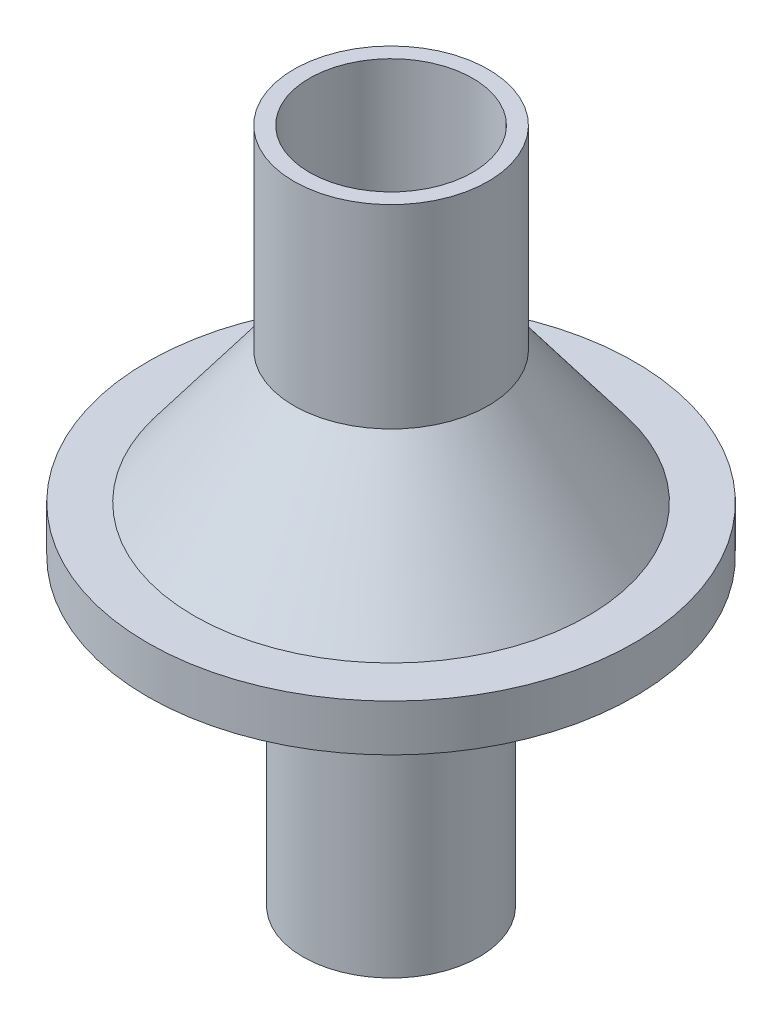
ISO-10303-21;
HEADER;
FILE_DESCRIPTION(('STEP AP214'),'2;1');
FILE_NAME('part.step','',(''),(''),'','','');
FILE_SCHEMA(('AUTOMOTIVE_DESIGN { 1 0 10303 214 1 1 1 1 }'));
ENDSEC;
DATA;
#1=APPLICATION_CONTEXT('core data for automotive mechanical design processes');
#2=APPLICATION_PROTOCOL_DEFINITION('international standard','automotive_design',2000,#1);
#3=PRODUCT_CONTEXT('',#1,'mechanical');
#4=PRODUCT('Part','Part','',(#3));
#5=PRODUCT_RELATED_PRODUCT_CATEGORY('part','',(#4));
#6=PRODUCT_DEFINITION_FORMATION('','',#4);
#7=PRODUCT_DEFINITION_CONTEXT('part definition',#1,'design');
#8=PRODUCT_DEFINITION('design','',#6,#7);
#9=PRODUCT_DEFINITION_SHAPE('','',#8);
#10=(LENGTH_UNIT() NAMED_UNIT(*) SI_UNIT(.MILLI.,.METRE.));
#11=(NAMED_UNIT(*) PLANE_ANGLE_UNIT() SI_UNIT($,.RADIAN.));
#12=(NAMED_UNIT(*) SI_UNIT($,.STERADIAN.) SOLID_ANGLE_UNIT());
#13=UNCERTAINTY_MEASURE_WITH_UNIT(LENGTH_MEASURE(1.E-05),#10,'distance_accuracy_value','');
#14=(GEOMETRIC_REPRESENTATION_CONTEXT(3) GLOBAL_UNCERTAINTY_ASSIGNED_CONTEXT((#13)) GLOBAL_UNIT_ASSIGNED_CONTEXT((#10,
#11,#12)) REPRESENTATION_CONTEXT('',''));
#15=CARTESIAN_POINT('',(0.,0.,0.));
#16=DIRECTION('',(0.,0.,1.));
#17=DIRECTION('',(1.,0.,0.));
#18=AXIS2_PLACEMENT_3D('',#15,#16,#17);
#19=CARTESIAN_POINT('',(0.,0.,0.));
#20=DIRECTION('',(0.,1.,0.));
#21=DIRECTION('',(0.,0.,1.));
#22=AXIS2_PLACEMENT_3D('',#19,#20,#21);
#23=PLANE('',#22);
#24=CARTESIAN_POINT('',(0.,0.,0.));
#25=DIRECTION('',(0.,1.,0.));
#26=DIRECTION('',(0.,0.,1.));
#27=AXIS2_PLACEMENT_3D('',#24,#25,#26);
#28=CIRCLE('',#27,11.325);
#29=CARTESIAN_POINT('',(0.,0.,11.325));
#30=VERTEX_POINT('',#29);
#31=EDGE_CURVE('E41',#30,#30,#28,.T.);
#32=ORIENTED_EDGE('',*,*,#31,.F.);
#33=EDGE_LOOP('',(#32));
#34=FACE_BOUND('',#33,.T.);
#35=CARTESIAN_POINT('',(0.,0.,0.));
#36=DIRECTION('',(0.,1.,0.));
#37=DIRECTION('',(0.,0.,1.));
#38=AXIS2_PLACEMENT_3D('',#35,#36,#37);
#39=CIRCLE('',#38,9.325);
#40=CARTESIAN_POINT('',(0.,0.,9.325));
#41=VERTEX_POINT('',#40);
#42=EDGE_CURVE('E50',#41,#41,#39,.T.);
#43=ORIENTED_EDGE('',*,*,#42,.T.);
#44=EDGE_LOOP('',(#43));
#45=FACE_BOUND('',#44,.T.);
#46=ADVANCED_FACE('F37',(#34,#45),#23,.F.);
#47=CARTESIAN_POINT('',(0.,25.,0.));
#48=DIRECTION('',(0.,-1.,0.));
#49=DIRECTION('',(0.,0.,-1.));
#50=AXIS2_PLACEMENT_3D('',#47,#48,#49);
#51=CYLINDRICAL_SURFACE('',#50,11.325);
#52=CARTESIAN_POINT('',(0.,25.,0.));
#53=DIRECTION('',(0.,1.,0.));
#54=DIRECTION('',(0.,0.,1.));
#55=AXIS2_PLACEMENT_3D('',#52,#53,#54);
#56=CIRCLE('',#55,11.325);
#57=CARTESIAN_POINT('',(0.,25.,11.325));
#58=VERTEX_POINT('',#57);
#59=EDGE_CURVE('E10',#58,#58,#56,.T.);
#60=ORIENTED_EDGE('',*,*,#59,.F.);
#61=EDGE_LOOP('',(#60));
#62=FACE_BOUND('',#61,.T.);
#63=ORIENTED_EDGE('',*,*,#31,.T.);
#64=EDGE_LOOP('',(#63));
#65=FACE_BOUND('',#64,.T.);
#66=ADVANCED_FACE('F39',(#62,#65),#51,.T.);
#67=CARTESIAN_POINT('',(0.,25.,0.));
#68=DIRECTION('',(0.,-1.,0.));
#69=DIRECTION('',(0.,0.,-1.));
#70=AXIS2_PLACEMENT_3D('',#67,#68,#69);
#71=CYLINDRICAL_SURFACE('',#70,9.325);
#72=CARTESIAN_POINT('',(0.,25.,0.));
#73=DIRECTION('',(0.,1.,0.));
#74=DIRECTION('',(0.,0.,1.));
#75=AXIS2_PLACEMENT_3D('',#72,#73,#74);
#76=CIRCLE('',#75,9.325);
#77=CARTESIAN_POINT('',(0.,25.,9.325));
#78=VERTEX_POINT('',#77);
#79=EDGE_CURVE('E59',#78,#78,#76,.T.);
#80=ORIENTED_EDGE('',*,*,#79,.T.);
#81=EDGE_LOOP('',(#80));
#82=FACE_BOUND('',#81,.T.);
#83=ORIENTED_EDGE('',*,*,#42,.F.);
#84=EDGE_LOOP('',(#83));
#85=FACE_BOUND('',#84,.T.);
#86=ADVANCED_FACE('F115',(#82,#85),#71,.F.);
#87=CARTESIAN_POINT('',(-25.325,39.,0.));
#88=DIRECTION('',(0.,-1.,0.));
#89=DIRECTION('',(0.,0.,-1.));
#90=AXIS2_PLACEMENT_3D('',#87,#88,#89);
#91=PLANE('',#90);
#92=CARTESIAN_POINT('',(0.,39.,0.));
#93=DIRECTION('',(0.,1.,0.));
#94=DIRECTION('',(0.,0.,1.));
#95=AXIS2_PLACEMENT_3D('',#92,#93,#94);
#96=CIRCLE('',#95,25.325);
#97=CARTESIAN_POINT('',(0.,39.,25.325));
#98=VERTEX_POINT('',#97);
#99=EDGE_CURVE('E63',#98,#98,#96,.T.);
#100=ORIENTED_EDGE('',*,*,#99,.T.);
#101=EDGE_LOOP('',(#100));
#102=FACE_BOUND('',#101,.T.);
#103=CARTESIAN_POINT('',(0.,39.,0.));
#104=DIRECTION('',(0.,1.,0.));
#105=DIRECTION('',(0.,0.,1.));
#106=AXIS2_PLACEMENT_3D('',#103,#104,#105);
#107=CIRCLE('',#106,31.325);
#108=CARTESIAN_POINT('',(0.,39.,31.325));
#109=VERTEX_POINT('',#108);
#110=EDGE_CURVE('E55',#109,#109,#107,.T.);
#111=ORIENTED_EDGE('',*,*,#110,.F.);
#112=EDGE_LOOP('',(#111));
#113=FACE_BOUND('',#112,.T.);
#114=ADVANCED_FACE('F122',(#102,#113),#91,.T.);
#115=CARTESIAN_POINT('',(0.,25.,0.));
#116=DIRECTION('',(0.,1.,0.));
#117=DIRECTION('',(0.,0.,1.));
#118=AXIS2_PLACEMENT_3D('',#115,#116,#117);
#119=CYLINDRICAL_SURFACE('',#118,31.325);
#120=ORIENTED_EDGE('',*,*,#110,.T.);
#121=EDGE_LOOP('',(#120));
#122=FACE_BOUND('',#121,.T.);
#123=CARTESIAN_POINT('',(0.,45.,0.));
#124=DIRECTION('',(0.,1.,0.));
#125=DIRECTION('',(0.,0.,1.));
#126=AXIS2_PLACEMENT_3D('',#123,#124,#125);
#127=CIRCLE('',#126,31.325);
#128=CARTESIAN_POINT('',(0.,45.,31.325));
#129=VERTEX_POINT('',#128);
#130=EDGE_CURVE('E67',#129,#129,#127,.T.);
#131=ORIENTED_EDGE('',*,*,#130,.F.);
#132=EDGE_LOOP('',(#131));
#133=FACE_BOUND('',#132,.T.);
#134=ADVANCED_FACE('F126',(#122,#133),#119,.T.);
#135=CARTESIAN_POINT('',(0.,25.,0.));
#136=DIRECTION('',(0.,1.,0.));
#137=DIRECTION('',(0.,0.,1.));
#138=AXIS2_PLACEMENT_3D('',#135,#136,#137);
#139=CONICAL_SURFACE('',#138,9.325,0.755104403478673);
#140=CARTESIAN_POINT('',(0.,42.,0.));
#141=DIRECTION('',(0.,1.,0.));
#142=DIRECTION('',(0.,0.,1.));
#143=AXIS2_PLACEMENT_3D('',#140,#141,#142);
#144=CIRCLE('',#143,25.325);
#145=CARTESIAN_POINT('',(0.,42.,25.325));
#146=VERTEX_POINT('',#145);
#147=EDGE_CURVE('E91',#146,#146,#144,.T.);
#148=ORIENTED_EDGE('',*,*,#147,.T.);
#149=EDGE_LOOP('',(#148));
#150=FACE_BOUND('',#149,.T.);
#151=ORIENTED_EDGE('',*,*,#79,.F.);
#152=EDGE_LOOP('',(#151));
#153=FACE_BOUND('',#152,.T.);
#154=ADVANCED_FACE('F96',(#150,#153),#139,.F.);
#155=CARTESIAN_POINT('',(0.,39.,0.));
#156=DIRECTION('',(0.,1.,0.));
#157=DIRECTION('',(0.,0.,1.));
#158=AXIS2_PLACEMENT_3D('',#155,#156,#157);
#159=CONICAL_SURFACE('',#158,25.325,0.785398163397448);
#160=ORIENTED_EDGE('',*,*,#59,.T.);
#161=EDGE_LOOP('',(#160));
#162=FACE_BOUND('',#161,.T.);
#163=ORIENTED_EDGE('',*,*,#99,.F.);
#164=EDGE_LOOP('',(#163));
#165=FACE_BOUND('',#164,.T.);
#166=ADVANCED_FACE('F133',(#162,#165),#159,.T.);
#167=CARTESIAN_POINT('',(-31.325,45.,0.));
#168=DIRECTION('',(0.,1.,0.));
#169=DIRECTION('',(0.,0.,1.));
#170=AXIS2_PLACEMENT_3D('',#167,#168,#169);
#171=PLANE('',#170);
#172=ORIENTED_EDGE('',*,*,#130,.T.);
#173=EDGE_LOOP('',(#172));
#174=FACE_BOUND('',#173,.T.);
#175=CARTESIAN_POINT('',(0.,45.,0.));
#176=DIRECTION('',(0.,1.,0.));
#177=DIRECTION('',(0.,0.,1.));
#178=AXIS2_PLACEMENT_3D('',#175,#176,#177);
#179=CIRCLE('',#178,25.325);
#180=CARTESIAN_POINT('',(0.,45.,25.325));
#181=VERTEX_POINT('',#180);
#182=EDGE_CURVE('E71',#181,#181,#179,.T.);
#183=ORIENTED_EDGE('',*,*,#182,.F.);
#184=EDGE_LOOP('',(#183));
#185=FACE_BOUND('',#184,.T.);
#186=ADVANCED_FACE('F136',(#174,#185),#171,.T.);
#187=CARTESIAN_POINT('',(0.,62.,0.));
#188=DIRECTION('',(0.,-1.,0.));
#189=DIRECTION('',(0.,0.,-1.));
#190=AXIS2_PLACEMENT_3D('',#187,#188,#189);
#191=CONICAL_SURFACE('',#190,12.5,0.646318664145599);
#192=ORIENTED_EDGE('',*,*,#182,.T.);
#193=EDGE_LOOP('',(#192));
#194=FACE_BOUND('',#193,.T.);
#195=CARTESIAN_POINT('',(0.,62.,0.));
#196=DIRECTION('',(0.,1.,0.));
#197=DIRECTION('',(0.,0.,1.));
#198=AXIS2_PLACEMENT_3D('',#195,#196,#197);
#199=CIRCLE('',#198,12.5);
#200=CARTESIAN_POINT('',(0.,62.,12.5));
#201=VERTEX_POINT('',#200);
#202=EDGE_CURVE('E75',#201,#201,#199,.T.);
#203=ORIENTED_EDGE('',*,*,#202,.F.);
#204=EDGE_LOOP('',(#203));
#205=FACE_BOUND('',#204,.T.);
#206=ADVANCED_FACE('F139',(#194,#205),#191,.T.);
#207=CARTESIAN_POINT('',(0.,25.,0.));
#208=DIRECTION('',(0.,1.,0.));
#209=DIRECTION('',(0.,0.,1.));
#210=AXIS2_PLACEMENT_3D('',#207,#208,#209);
#211=CYLINDRICAL_SURFACE('',#210,12.5);
#212=ORIENTED_EDGE('',*,*,#202,.T.);
#213=EDGE_LOOP('',(#212));
#214=FACE_BOUND('',#213,.T.);
#215=CARTESIAN_POINT('',(0.,87.,0.));
#216=DIRECTION('',(0.,1.,0.));
#217=DIRECTION('',(0.,0.,1.));
#218=AXIS2_PLACEMENT_3D('',#215,#216,#217);
#219=CIRCLE('',#218,12.5);
#220=CARTESIAN_POINT('',(0.,87.,12.5));
#221=VERTEX_POINT('',#220);
#222=EDGE_CURVE('E79',#221,#221,#219,.T.);
#223=ORIENTED_EDGE('',*,*,#222,.F.);
#224=EDGE_LOOP('',(#223));
#225=FACE_BOUND('',#224,.T.);
#226=ADVANCED_FACE('F143',(#214,#225),#211,.T.);
#227=CARTESIAN_POINT('',(-12.5,87.,0.));
#228=DIRECTION('',(0.,1.,0.));
#229=DIRECTION('',(0.,0.,1.));
#230=AXIS2_PLACEMENT_3D('',#227,#228,#229);
#231=PLANE('',#230);
#232=ORIENTED_EDGE('',*,*,#222,.T.);
#233=EDGE_LOOP('',(#232));
#234=FACE_BOUND('',#233,.T.);
#235=CARTESIAN_POINT('',(0.,87.,0.));
#236=DIRECTION('',(0.,1.,0.));
#237=DIRECTION('',(0.,0.,1.));
#238=AXIS2_PLACEMENT_3D('',#235,#236,#237);
#239=CIRCLE('',#238,10.5);
#240=CARTESIAN_POINT('',(0.,87.,10.5));
#241=VERTEX_POINT('',#240);
#242=EDGE_CURVE('E83',#241,#241,#239,.T.);
#243=ORIENTED_EDGE('',*,*,#242,.F.);
#244=EDGE_LOOP('',(#243));
#245=FACE_BOUND('',#244,.T.);
#246=ADVANCED_FACE('F107',(#234,#245),#231,.T.);
#247=CARTESIAN_POINT('',(0.,25.,0.));
#248=DIRECTION('',(0.,1.,0.));
#249=DIRECTION('',(0.,0.,1.));
#250=AXIS2_PLACEMENT_3D('',#247,#248,#249);
#251=CYLINDRICAL_SURFACE('',#250,10.5);
#252=ORIENTED_EDGE('',*,*,#242,.T.);
#253=EDGE_LOOP('',(#252));
#254=FACE_BOUND('',#253,.T.);
#255=CARTESIAN_POINT('',(0.,62.,0.));
#256=DIRECTION('',(0.,1.,0.));
#257=DIRECTION('',(0.,0.,1.));
#258=AXIS2_PLACEMENT_3D('',#255,#256,#257);
#259=CIRCLE('',#258,10.5);
#260=CARTESIAN_POINT('',(0.,62.,10.5));
#261=VERTEX_POINT('',#260);
#262=EDGE_CURVE('E87',#261,#261,#259,.T.);
#263=ORIENTED_EDGE('',*,*,#262,.F.);
#264=EDGE_LOOP('',(#263));
#265=FACE_BOUND('',#264,.T.);
#266=ADVANCED_FACE('F101',(#254,#265),#251,.F.);
#267=CARTESIAN_POINT('',(0.,42.,0.));
#268=DIRECTION('',(0.,-1.,0.));
#269=DIRECTION('',(0.,0.,-1.));
#270=AXIS2_PLACEMENT_3D('',#267,#268,#269);
#271=CONICAL_SURFACE('',#270,25.325,0.63787754887401);
#272=ORIENTED_EDGE('',*,*,#262,.T.);
#273=EDGE_LOOP('',(#272));
#274=FACE_BOUND('',#273,.T.);
#275=ORIENTED_EDGE('',*,*,#147,.F.);
#276=EDGE_LOOP('',(#275));
#277=FACE_BOUND('',#276,.T.);
#278=ADVANCED_FACE('F99',(#274,#277),#271,.F.);
#279=CLOSED_SHELL('',(#46,#66,#86,#114,#134,#154,#166,#186,#206,#226,#246,#266,#278));
#280=MANIFOLD_SOLID_BREP('B2',#279);
#281=ADVANCED_BREP_SHAPE_REPRESENTATION('',(#18,#280),#14);
#282=SHAPE_DEFINITION_REPRESENTATION(#9,#281);
ENDSEC;
END-ISO-10303-21;
